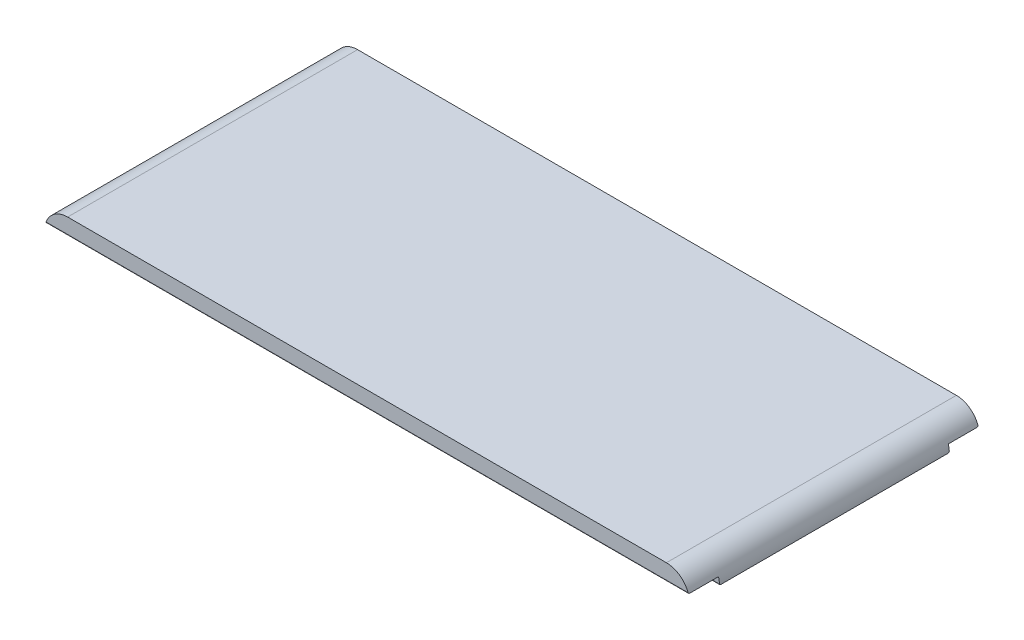
ISO-10303-21;
HEADER;
FILE_DESCRIPTION(('STEP AP214'),'2;1');
FILE_NAME('part.step','',(''),(''),'','','');
FILE_SCHEMA(('AUTOMOTIVE_DESIGN { 1 0 10303 214 1 1 1 1 }'));
ENDSEC;
DATA;
#1=APPLICATION_CONTEXT('core data for automotive mechanical design processes');
#2=APPLICATION_PROTOCOL_DEFINITION('international standard','automotive_design',2000,#1);
#3=PRODUCT_CONTEXT('',#1,'mechanical');
#4=PRODUCT('Part','Part','',(#3));
#5=PRODUCT_RELATED_PRODUCT_CATEGORY('part','',(#4));
#6=PRODUCT_DEFINITION_FORMATION('','',#4);
#7=PRODUCT_DEFINITION_CONTEXT('part definition',#1,'design');
#8=PRODUCT_DEFINITION('design','',#6,#7);
#9=PRODUCT_DEFINITION_SHAPE('','',#8);
#10=(LENGTH_UNIT() NAMED_UNIT(*) SI_UNIT(.MILLI.,.METRE.));
#11=(NAMED_UNIT(*) PLANE_ANGLE_UNIT() SI_UNIT($,.RADIAN.));
#12=(NAMED_UNIT(*) SI_UNIT($,.STERADIAN.) SOLID_ANGLE_UNIT());
#13=UNCERTAINTY_MEASURE_WITH_UNIT(LENGTH_MEASURE(1.E-05),#10,'distance_accuracy_value','');
#14=(GEOMETRIC_REPRESENTATION_CONTEXT(3) GLOBAL_UNCERTAINTY_ASSIGNED_CONTEXT((#13)) GLOBAL_UNIT_ASSIGNED_CONTEXT((#10,
#11,#12)) REPRESENTATION_CONTEXT('',''));
#15=CARTESIAN_POINT('',(0.,0.,0.));
#16=DIRECTION('',(0.,0.,1.));
#17=DIRECTION('',(1.,0.,0.));
#18=AXIS2_PLACEMENT_3D('',#15,#16,#17);
#19=CARTESIAN_POINT('',(-335.779914326901,-4.,0.));
#20=DIRECTION('',(0.,0.,-1.));
#21=DIRECTION('',(-1.,0.,0.));
#22=AXIS2_PLACEMENT_3D('',#19,#20,#21);
#23=CYLINDRICAL_SURFACE('',#22,10.);
#24=DIRECTION('',(0.,0.,1.));
#25=VECTOR('',#24,1.);
#26=CARTESIAN_POINT('',(-325.779914326901,-4.,0.));
#27=LINE('',#26,#25);
#28=CARTESIAN_POINT('',(-325.779914326901,-4.,-284.703611354948));
#29=VERTEX_POINT('',#28);
#30=CARTESIAN_POINT('',(-325.779914326901,-4.,-185.903611354948));
#31=VERTEX_POINT('',#30);
#32=EDGE_CURVE('E130',#29,#31,#27,.T.);
#33=ORIENTED_EDGE('',*,*,#32,.F.);
#34=CARTESIAN_POINT('',(-325.792422149182,-3.5,-285.203611354948));
#35=CARTESIAN_POINT('',(-325.791011271708,-3.52809080111915,-285.203635471879));
#36=CARTESIAN_POINT('',(-325.789728233576,-3.55618160499886,-285.201245470063));
#37=CARTESIAN_POINT('',(-325.787424342929,-3.6115583196578,-285.191808528034));
#38=CARTESIAN_POINT('',(-325.786403278723,-3.63884486443976,-285.184765364391));
#39=CARTESIAN_POINT('',(-325.784627081456,-3.69186985671174,-285.166188120238));
#40=CARTESIAN_POINT('',(-325.783872085288,-3.71760750164784,-285.15465173433));
#41=CARTESIAN_POINT('',(-325.782604001737,-3.76678300908643,-285.127422867738));
#42=CARTESIAN_POINT('',(-325.78209088282,-3.79022117107167,-285.111730929257));
#43=CARTESIAN_POINT('',(-325.781266074048,-3.83411984508959,-285.076643683722));
#44=CARTESIAN_POINT('',(-325.78095426411,-3.85458212662166,-285.057250593418));
#45=CARTESIAN_POINT('',(-325.780480422496,-3.89196426237688,-285.01530548335));
#46=CARTESIAN_POINT('',(-325.780318391846,-3.90888409231035,-284.992753441928));
#47=CARTESIAN_POINT('',(-325.780091008154,-3.93870360092056,-284.94512461966));
#48=CARTESIAN_POINT('',(-325.78002567722,-3.95160235974047,-284.920047262858));
#49=CARTESIAN_POINT('',(-325.779945052491,-3.97301175114872,-284.868080613789));
#50=CARTESIAN_POINT('',(-325.779929764532,-3.98152187189826,-284.841191110586));
#51=CARTESIAN_POINT('',(-325.779913988936,-3.9939020188409,-284.786368236673));
#52=CARTESIAN_POINT('',(-325.779913499656,-3.99777255979681,-284.758434982122));
#53=CARTESIAN_POINT('',(-325.779915206238,-4.00079506304713,-284.702292063512));
#54=CARTESIAN_POINT('',(-325.779917404333,-3.99994309610881,-284.674082188782));
#55=CARTESIAN_POINT('',(-325.779914875881,-3.99668645152289,-284.646143373658));
#56=B_SPLINE_CURVE_WITH_KNOTS('',3,(#34,#35,#36,#37,#38,#39,#40,#41,#42,#43,#44,#45,#46,#47,#48,
#49,#50,#51,#52,#53,#54,#55),.UNSPECIFIED.,.F.,.F.,(4,2,2,2,2,2,2,2,2,2,4),(0.,
0.0842678073475772,0.168467305649976,0.252710062350624,0.336941832739368,0.4211233111659,
0.505305366784203,0.58950666571089,0.673717782660477,0.757919555495587,0.842191396609046),.UNSPECIFIED.);
#57=CARTESIAN_POINT('',(-325.792422149182,-3.5,-285.203611354948));
#58=VERTEX_POINT('',#57);
#59=EDGE_CURVE('E11',#58,#29,#56,.T.);
#60=ORIENTED_EDGE('',*,*,#59,.F.);
#61=CARTESIAN_POINT('',(-335.779914326901,-4.,-285.203611354948));
#62=DIRECTION('',(0.,0.,-1.));
#63=DIRECTION('',(-1.,0.,0.));
#64=AXIS2_PLACEMENT_3D('',#61,#62,#63);
#65=CIRCLE('',#64,10.);
#66=CARTESIAN_POINT('',(-326.240522312731,-1.,-285.203611354948));
#67=VERTEX_POINT('',#66);
#68=EDGE_CURVE('E54',#67,#58,#65,.T.);
#69=ORIENTED_EDGE('',*,*,#68,.F.);
#70=DIRECTION('',(0.,0.,-1.));
#71=VECTOR('',#70,1.);
#72=CARTESIAN_POINT('',(-326.240522312731,-1.,0.));
#73=LINE('',#72,#71);
#74=CARTESIAN_POINT('',(-326.240522312731,-1.,-297.753611354948));
#75=VERTEX_POINT('',#74);
#76=EDGE_CURVE('E252',#75,#67,#73,.F.);
#77=ORIENTED_EDGE('',*,*,#76,.F.);
#78=CARTESIAN_POINT('',(-326.412417329303,-0.5,-298.253611354948));
#79=CARTESIAN_POINT('',(-326.401511394738,-0.529172653221636,-298.253630593243));
#80=CARTESIAN_POINT('',(-326.390747980806,-0.558411714080814,-298.251058502554));
#81=CARTESIAN_POINT('',(-326.369761504841,-0.616223919635847,-298.240797328865));
#82=CARTESIAN_POINT('',(-326.359539239715,-0.644796049399874,-298.233100914189));
#83=CARTESIAN_POINT('',(-326.33990830364,-0.700429394208502,-298.212641586647));
#84=CARTESIAN_POINT('',(-326.330500891963,-0.727488248556696,-298.199870996504));
#85=CARTESIAN_POINT('',(-326.312773136196,-0.779133501081687,-298.169520145201));
#86=CARTESIAN_POINT('',(-326.30445189417,-0.803721937630512,-298.151943894566));
#87=CARTESIAN_POINT('',(-326.289417162937,-0.848650370660997,-298.113178396005));
#88=CARTESIAN_POINT('',(-326.282653292116,-0.869119473225691,-298.092158542015));
#89=CARTESIAN_POINT('',(-326.270504515063,-0.906214806618339,-298.046615238539));
#90=CARTESIAN_POINT('',(-326.265119271472,-0.922841977497598,-298.022092648491));
#91=CARTESIAN_POINT('',(-326.256120178062,-0.950811508377243,-297.971681326914));
#92=CARTESIAN_POINT('',(-326.252426186524,-0.962391319981318,-297.945938516495));
#93=CARTESIAN_POINT('',(-326.24648610315,-0.981085965580566,-297.892721384494));
#94=CARTESIAN_POINT('',(-326.244239686956,-0.988201799812208,-297.86524745232));
#95=CARTESIAN_POINT('',(-326.241310304234,-0.997490833230506,-297.810532263963));
#96=CARTESIAN_POINT('',(-326.240568427805,-0.999850245592909,-297.783325611016));
#97=CARTESIAN_POINT('',(-326.240480049208,-1.00013751187326,-297.728847774794));
#98=CARTESIAN_POINT('',(-326.241135607125,-0.998058823173914,-297.701576555532));
#99=CARTESIAN_POINT('',(-326.242495743797,-0.993732086013512,-297.674689702401));
#100=B_SPLINE_CURVE_WITH_KNOTS('',3,(#78,#79,#80,#81,#82,#83,#84,#85,#86,#87,#88,#89,#90,#91,
#92,#93,#94,#95,#96,#97,#98,#99),.UNSPECIFIED.,.F.,.F.,(4,2,2,2,2,2,2,2,2,2,4),(0.,
0.0933472675150289,0.186828380337061,0.280451472874327,0.373996670254914,0.463860732501441,
0.553702783295467,0.638679019050742,0.723636207505771,0.805197184813385,0.886878481750885),.UNSPECIFIED.);
#101=CARTESIAN_POINT('',(-326.412417329303,-0.5,-298.253611354948));
#102=VERTEX_POINT('',#101);
#103=EDGE_CURVE('E245',#102,#75,#100,.T.);
#104=ORIENTED_EDGE('',*,*,#103,.F.);
#105=CARTESIAN_POINT('',(-335.779914326901,-4.,-298.253611354948));
#106=DIRECTION('',(0.,0.,-1.));
#107=DIRECTION('',(-1.,0.,0.));
#108=AXIS2_PLACEMENT_3D('',#105,#106,#107);
#109=CIRCLE('',#108,10.);
#110=CARTESIAN_POINT('',(-335.779914326901,6.,-298.253611354948));
#111=VERTEX_POINT('',#110);
#112=EDGE_CURVE('E242',#111,#102,#109,.T.);
#113=ORIENTED_EDGE('',*,*,#112,.F.);
#114=DIRECTION('',(0.,0.,1.));
#115=VECTOR('',#114,1.);
#116=CARTESIAN_POINT('',(-335.779914326901,6.,0.));
#117=LINE('',#116,#115);
#118=CARTESIAN_POINT('',(-335.779914326901,6.,-172.353611354948));
#119=VERTEX_POINT('',#118);
#120=EDGE_CURVE('E239',#119,#111,#117,.F.);
#121=ORIENTED_EDGE('',*,*,#120,.F.);
#122=CARTESIAN_POINT('',(-335.779914326901,-4.,-172.353611354948));
#123=DIRECTION('',(0.,0.,1.));
#124=DIRECTION('',(1.,0.,0.));
#125=AXIS2_PLACEMENT_3D('',#122,#123,#124);
#126=CIRCLE('',#125,10.);
#127=CARTESIAN_POINT('',(-326.412417329303,-0.5,-172.353611354948));
#128=VERTEX_POINT('',#127);
#129=EDGE_CURVE('E234',#128,#119,#126,.T.);
#130=ORIENTED_EDGE('',*,*,#129,.F.);
#131=CARTESIAN_POINT('',(-326.240522312731,-1.,-172.853611354948));
#132=CARTESIAN_POINT('',(-326.240516834523,-1.00002795140279,-172.826464107377));
#133=CARTESIAN_POINT('',(-326.241217073254,-0.997790921745027,-172.799330362119));
#134=CARTESIAN_POINT('',(-326.243986515588,-0.989000403490608,-172.745895702141));
#135=CARTESIAN_POINT('',(-326.24605303972,-0.982455363596605,-172.719593262696));
#136=CARTESIAN_POINT('',(-326.251513135226,-0.965260011054922,-172.668512589204));
#137=CARTESIAN_POINT('',(-326.254906831537,-0.95460931191396,-172.643734498909));
#138=CARTESIAN_POINT('',(-326.262945353714,-0.929580668969439,-172.596360736281));
#139=CARTESIAN_POINT('',(-326.267590389749,-0.915202099065748,-172.573765431425));
#140=CARTESIAN_POINT('',(-326.278122469576,-0.882911043350927,-172.530949494677));
#141=CARTESIAN_POINT('',(-326.284029670137,-0.864941554975013,-172.510776883163));
#142=CARTESIAN_POINT('',(-326.296905832196,-0.826206350932752,-172.473732486453));
#143=CARTESIAN_POINT('',(-326.303874886772,-0.805440390154803,-172.45686099092));
#144=CARTESIAN_POINT('',(-326.319052016118,-0.760761900585836,-172.426094589591));
#145=CARTESIAN_POINT('',(-326.32730095154,-0.736751472160278,-172.412362151231));
#146=CARTESIAN_POINT('',(-326.34461091894,-0.68703384227384,-172.389097891837));
#147=CARTESIAN_POINT('',(-326.353672519193,-0.661325456840943,-172.379569038253));
#148=CARTESIAN_POINT('',(-326.372903310711,-0.60750900852016,-172.364466238171));
#149=CARTESIAN_POINT('',(-326.383105804918,-0.579346105138669,-172.359130559073));
#150=CARTESIAN_POINT('',(-326.403919211593,-0.522694518658771,-172.353311920966));
#151=CARTESIAN_POINT('',(-326.414529816969,-0.494206091431464,-172.352825382144));
#152=CARTESIAN_POINT('',(-326.425219372644,-0.465925536608026,-172.354773775224));
#153=B_SPLINE_CURVE_WITH_KNOTS('',3,(#131,#132,#133,#134,#135,#136,#137,#138,#139,#140,#141,
#142,#143,#144,#145,#146,#147,#148,#149,#150,#151,#152),.UNSPECIFIED.,.F.,.F.,(4,2,2,2,2,2,2,2,
2,2,4),(0.,0.0813201609982403,0.162481313341148,0.243650107794974,0.324832543481057,
0.407423959785907,0.490022619969363,0.576234016887954,0.662506176293527,0.753383590636309,
0.844193910998825),.UNSPECIFIED.);
#154=CARTESIAN_POINT('',(-326.240522312731,-1.,-172.853611354948));
#155=VERTEX_POINT('',#154);
#156=EDGE_CURVE('E226',#155,#128,#153,.T.);
#157=ORIENTED_EDGE('',*,*,#156,.F.);
#158=DIRECTION('',(0.,0.,-1.));
#159=VECTOR('',#158,1.);
#160=CARTESIAN_POINT('',(-326.240522312731,-1.,0.));
#161=LINE('',#160,#159);
#162=CARTESIAN_POINT('',(-326.240522312731,-1.,-185.403611354948));
#163=VERTEX_POINT('',#162);
#164=EDGE_CURVE('E235',#163,#155,#161,.F.);
#165=ORIENTED_EDGE('',*,*,#164,.F.);
#166=CARTESIAN_POINT('',(-335.779914326901,-4.,-185.403611354948));
#167=DIRECTION('',(0.,0.,1.));
#168=DIRECTION('',(1.,0.,0.));
#169=AXIS2_PLACEMENT_3D('',#166,#167,#168);
#170=CIRCLE('',#169,10.);
#171=CARTESIAN_POINT('',(-325.792422149182,-3.5,-185.403611354948));
#172=VERTEX_POINT('',#171);
#173=EDGE_CURVE('E132',#172,#163,#170,.T.);
#174=ORIENTED_EDGE('',*,*,#173,.F.);
#175=CARTESIAN_POINT('',(-325.779914326901,-4.,-185.903611354948));
#176=CARTESIAN_POINT('',(-325.779917707812,-4.00002388656531,-185.875482249191));
#177=CARTESIAN_POINT('',(-325.779914383478,-3.9976276863461,-185.847360276428));
#178=CARTESIAN_POINT('',(-325.779919312572,-3.98817159620143,-185.791934515045));
#179=CARTESIAN_POINT('',(-325.779927556438,-3.98111556064199,-185.764630069707));
#180=CARTESIAN_POINT('',(-325.779980545843,-3.96251132893289,-185.711581620624));
#181=CARTESIAN_POINT('',(-325.780025308732,-3.9509609988357,-185.685838364872));
#182=CARTESIAN_POINT('',(-325.780196061062,-3.92370544649548,-185.636659052178));
#183=CARTESIAN_POINT('',(-325.780322041042,-3.90800070829474,-185.613222726884));
#184=CARTESIAN_POINT('',(-325.780706971633,-3.87288079822787,-185.569320807143));
#185=CARTESIAN_POINT('',(-325.780965916122,-3.85346579724859,-185.548855075953));
#186=CARTESIAN_POINT('',(-325.781669499671,-3.81147808534619,-185.511474312912));
#187=CARTESIAN_POINT('',(-325.782114136726,-3.7889054085522,-185.494559242689));
#188=CARTESIAN_POINT('',(-325.783233955363,-3.74125731239429,-185.464767548114));
#189=CARTESIAN_POINT('',(-325.783909021488,-3.71618315085061,-185.451888907484));
#190=CARTESIAN_POINT('',(-325.785519019617,-3.66423364484929,-185.430518652406));
#191=CARTESIAN_POINT('',(-325.786453986411,-3.63735805962226,-185.42202762571));
#192=CARTESIAN_POINT('',(-325.788592543248,-3.58258844321756,-185.409683147878));
#193=CARTESIAN_POINT('',(-325.789795991766,-3.55469495506332,-185.405827260234));
#194=CARTESIAN_POINT('',(-325.79244930988,-3.49864594646549,-185.402819083579));
#195=CARTESIAN_POINT('',(-325.793899372546,-3.4704902371846,-185.403670496405));
#196=CARTESIAN_POINT('',(-325.795460527222,-3.44261115719796,-185.406915753274));
#197=B_SPLINE_CURVE_WITH_KNOTS('',3,(#175,#176,#177,#178,#179,#180,#181,#182,#183,#184,#185,
#186,#187,#188,#189,#190,#191,#192,#193,#194,#195,#196),.UNSPECIFIED.,.F.,.F.,(4,2,2,2,2,2,2,2,
2,2,4),(0.,0.0842752187023845,0.168480816623155,0.252726445304886,0.336962262601395,
0.421194201109253,0.505425229282856,0.589614115065589,0.673814275643185,0.757970156184569,
0.84219222661053),.UNSPECIFIED.);
#198=EDGE_CURVE('E128',#31,#172,#197,.T.);
#199=ORIENTED_EDGE('',*,*,#198,.F.);
#200=EDGE_LOOP('',(#33,#60,#69,#77,#104,#113,#121,#130,#157,#165,#174,#199));
#201=FACE_BOUND('',#200,.T.);
#202=ADVANCED_FACE('F41',(#201),#23,.T.);
#203=CARTESIAN_POINT('',(-595.779914326901,-4.,0.));
#204=DIRECTION('',(0.,0.,-1.));
#205=DIRECTION('',(-1.,0.,0.));
#206=AXIS2_PLACEMENT_3D('',#203,#204,#205);
#207=CYLINDRICAL_SURFACE('',#206,10.);
#208=DIRECTION('',(0.,0.,1.));
#209=VECTOR('',#208,1.);
#210=CARTESIAN_POINT('',(-605.779914326901,-4.,0.));
#211=LINE('',#210,#209);
#212=CARTESIAN_POINT('',(-605.779914326901,-4.,-284.703611354948));
#213=VERTEX_POINT('',#212);
#214=CARTESIAN_POINT('',(-605.779914326901,-4.,-185.903611354948));
#215=VERTEX_POINT('',#214);
#216=EDGE_CURVE('E148',#213,#215,#211,.T.);
#217=ORIENTED_EDGE('',*,*,#216,.T.);
#218=CARTESIAN_POINT('',(-605.76740650462,-3.5,-185.403611354948));
#219=CARTESIAN_POINT('',(-605.768817382094,-3.52809080111914,-185.403587238017));
#220=CARTESIAN_POINT('',(-605.770100420226,-3.55618160499886,-185.405977239833));
#221=CARTESIAN_POINT('',(-605.772404310873,-3.61155831965781,-185.415414181862));
#222=CARTESIAN_POINT('',(-605.773425375078,-3.63884486443976,-185.422457345505));
#223=CARTESIAN_POINT('',(-605.775201572346,-3.69186985671173,-185.441034589658));
#224=CARTESIAN_POINT('',(-605.775956568514,-3.71760750164781,-185.452570975566));
#225=CARTESIAN_POINT('',(-605.777224652065,-3.76678300908641,-185.479799842158));
#226=CARTESIAN_POINT('',(-605.777737770982,-3.79022117107165,-185.495491780638));
#227=CARTESIAN_POINT('',(-605.778562579754,-3.83411984508959,-185.530579026174));
#228=CARTESIAN_POINT('',(-605.778874389692,-3.85458212662167,-185.549972116478));
#229=CARTESIAN_POINT('',(-605.779348231306,-3.89196426237689,-185.591917226546));
#230=CARTESIAN_POINT('',(-605.779510261956,-3.90888409231036,-185.614469267968));
#231=CARTESIAN_POINT('',(-605.779737645648,-3.93870360092056,-185.662098090236));
#232=CARTESIAN_POINT('',(-605.779802976582,-3.95160235974049,-185.687175447038));
#233=CARTESIAN_POINT('',(-605.779883601311,-3.97301175114873,-185.739142096107));
#234=CARTESIAN_POINT('',(-605.77989888927,-3.98152187189826,-185.76603159931));
#235=CARTESIAN_POINT('',(-605.779914664866,-3.99390201884089,-185.820854473223));
#236=CARTESIAN_POINT('',(-605.779915154145,-3.9977725597968,-185.848787727774));
#237=CARTESIAN_POINT('',(-605.779913447564,-4.00079506304714,-185.904930646384));
#238=CARTESIAN_POINT('',(-605.779911249469,-3.99994309610881,-185.933140521113));
#239=CARTESIAN_POINT('',(-605.779913777921,-3.99668645152289,-185.961079336238));
#240=B_SPLINE_CURVE_WITH_KNOTS('',3,(#218,#219,#220,#221,#222,#223,#224,#225,#226,#227,#228,
#229,#230,#231,#232,#233,#234,#235,#236,#237,#238,#239),.UNSPECIFIED.,.F.,.F.,(4,2,2,2,2,2,2,2,
2,2,4),(0.,0.0842678073475747,0.168467305649968,0.25271006235059,0.336941832739348,
0.421123311165919,0.50530536678424,0.589506665710928,0.673717782660512,0.757919555495511,
0.842191396608998),.UNSPECIFIED.);
#241=CARTESIAN_POINT('',(-605.76740650462,-3.5,-185.403611354948));
#242=VERTEX_POINT('',#241);
#243=EDGE_CURVE('E137',#242,#215,#240,.T.);
#244=ORIENTED_EDGE('',*,*,#243,.F.);
#245=CARTESIAN_POINT('',(-595.779914326901,-4.,-185.403611354948));
#246=DIRECTION('',(0.,0.,1.));
#247=DIRECTION('',(1.,0.,0.));
#248=AXIS2_PLACEMENT_3D('',#245,#246,#247);
#249=CIRCLE('',#248,10.);
#250=CARTESIAN_POINT('',(-605.31930634107,-1.,-185.403611354948));
#251=VERTEX_POINT('',#250);
#252=EDGE_CURVE('E302',#251,#242,#249,.T.);
#253=ORIENTED_EDGE('',*,*,#252,.F.);
#254=DIRECTION('',(0.,0.,-1.));
#255=VECTOR('',#254,1.);
#256=CARTESIAN_POINT('',(-605.31930634107,-1.,0.));
#257=LINE('',#256,#255);
#258=CARTESIAN_POINT('',(-605.31930634107,-1.,-172.853611354948));
#259=VERTEX_POINT('',#258);
#260=EDGE_CURVE('E213',#259,#251,#257,.T.);
#261=ORIENTED_EDGE('',*,*,#260,.F.);
#262=CARTESIAN_POINT('',(-605.147411324499,-0.500000000000016,-172.353611354948));
#263=CARTESIAN_POINT('',(-605.158317259064,-0.529172653221676,-172.353592116653));
#264=CARTESIAN_POINT('',(-605.169080672996,-0.558411714080868,-172.356164207342));
#265=CARTESIAN_POINT('',(-605.190067148961,-0.616223919635903,-172.366425381031));
#266=CARTESIAN_POINT('',(-605.200289414087,-0.644796049399918,-172.374121795707));
#267=CARTESIAN_POINT('',(-605.219920350162,-0.70042939420853,-172.394581123249));
#268=CARTESIAN_POINT('',(-605.229327761839,-0.727488248556719,-172.407351713392));
#269=CARTESIAN_POINT('',(-605.247055517606,-0.779133501081707,-172.437702564695));
#270=CARTESIAN_POINT('',(-605.255376759632,-0.803721937630533,-172.45527881533));
#271=CARTESIAN_POINT('',(-605.270411490864,-0.848650370661007,-172.494044313891));
#272=CARTESIAN_POINT('',(-605.277175361686,-0.86911947322569,-172.515064167881));
#273=CARTESIAN_POINT('',(-605.289324138739,-0.906214806618347,-172.560607471357));
#274=CARTESIAN_POINT('',(-605.294709382329,-0.922841977497623,-172.585130061405));
#275=CARTESIAN_POINT('',(-605.303708475739,-0.950811508377274,-172.635541382982));
#276=CARTESIAN_POINT('',(-605.307402467278,-0.96239131998134,-172.661284193401));
#277=CARTESIAN_POINT('',(-605.313342550652,-0.981085965580579,-172.714501325402));
#278=CARTESIAN_POINT('',(-605.315588966845,-0.988201799812222,-172.741975257576));
#279=CARTESIAN_POINT('',(-605.318518349568,-0.997490833230516,-172.796690445933));
#280=CARTESIAN_POINT('',(-605.319260225997,-0.999850245592914,-172.82389709888));
#281=CARTESIAN_POINT('',(-605.319348604594,-1.00013751187325,-172.878374935102));
#282=CARTESIAN_POINT('',(-605.318693046677,-0.998058823173903,-172.905646154364));
#283=CARTESIAN_POINT('',(-605.317332910005,-0.993732086013495,-172.932533007495));
#284=B_SPLINE_CURVE_WITH_KNOTS('',3,(#262,#263,#264,#265,#266,#267,#268,#269,#270,#271,#272,
#273,#274,#275,#276,#277,#278,#279,#280,#281,#282,#283),.UNSPECIFIED.,.F.,.F.,(4,2,2,2,2,2,2,2,
2,2,4),(0.,0.0933472675150529,0.18682838033706,0.280451472874314,0.373996670254899,
0.463860732501399,0.553702783295465,0.638679019050776,0.723636207505803,0.805197184813415,
0.886878481750972),.UNSPECIFIED.);
#285=CARTESIAN_POINT('',(-605.147411324499,-0.5,-172.353611354948));
#286=VERTEX_POINT('',#285);
#287=EDGE_CURVE('E205',#286,#259,#284,.T.);
#288=ORIENTED_EDGE('',*,*,#287,.F.);
#289=CARTESIAN_POINT('',(-595.779914326901,-4.,-172.353611354948));
#290=DIRECTION('',(0.,0.,1.));
#291=DIRECTION('',(1.,0.,0.));
#292=AXIS2_PLACEMENT_3D('',#289,#290,#291);
#293=CIRCLE('',#292,10.);
#294=CARTESIAN_POINT('',(-595.779914326901,6.,-172.353611354948));
#295=VERTEX_POINT('',#294);
#296=EDGE_CURVE('E214',#295,#286,#293,.T.);
#297=ORIENTED_EDGE('',*,*,#296,.F.);
#298=DIRECTION('',(0.,0.,-1.));
#299=VECTOR('',#298,1.);
#300=CARTESIAN_POINT('',(-595.779914326901,6.,0.));
#301=LINE('',#300,#299);
#302=CARTESIAN_POINT('',(-595.779914326901,6.,-298.253611354948));
#303=VERTEX_POINT('',#302);
#304=EDGE_CURVE('E271',#303,#295,#301,.F.);
#305=ORIENTED_EDGE('',*,*,#304,.F.);
#306=CARTESIAN_POINT('',(-595.779914326901,-4.,-298.253611354948));
#307=DIRECTION('',(0.,0.,-1.));
#308=DIRECTION('',(-1.,0.,0.));
#309=AXIS2_PLACEMENT_3D('',#306,#307,#308);
#310=CIRCLE('',#309,10.);
#311=CARTESIAN_POINT('',(-605.147411324499,-0.5,-298.253611354948));
#312=VERTEX_POINT('',#311);
#313=EDGE_CURVE('E267',#312,#303,#310,.T.);
#314=ORIENTED_EDGE('',*,*,#313,.F.);
#315=CARTESIAN_POINT('',(-605.31930634107,-1.,-297.753611354948));
#316=CARTESIAN_POINT('',(-605.319311819279,-1.00002795140278,-297.780758602519));
#317=CARTESIAN_POINT('',(-605.318611580548,-0.997790921745017,-297.807892347777));
#318=CARTESIAN_POINT('',(-605.315842138214,-0.989000403490586,-297.861327007755));
#319=CARTESIAN_POINT('',(-605.313775614082,-0.982455363596581,-297.8876294472));
#320=CARTESIAN_POINT('',(-605.308315518575,-0.965260011054894,-297.938710120692));
#321=CARTESIAN_POINT('',(-605.304921822265,-0.954609311913933,-297.963488210987));
#322=CARTESIAN_POINT('',(-605.296883300088,-0.929580668969398,-298.010861973615));
#323=CARTESIAN_POINT('',(-605.292238264053,-0.915202099065687,-298.033457278471));
#324=CARTESIAN_POINT('',(-605.281706184226,-0.88291104335085,-298.076273215219));
#325=CARTESIAN_POINT('',(-605.275798983665,-0.86494155497494,-298.096445826733));
#326=CARTESIAN_POINT('',(-605.262922821606,-0.826206350932676,-298.133490223443));
#327=CARTESIAN_POINT('',(-605.255953767029,-0.805440390154727,-298.150361718976));
#328=CARTESIAN_POINT('',(-605.240776637684,-0.760761900585745,-298.181128120305));
#329=CARTESIAN_POINT('',(-605.232527702262,-0.736751472160171,-298.194860558665));
#330=CARTESIAN_POINT('',(-605.215217734861,-0.687033842273726,-298.218124818059));
#331=CARTESIAN_POINT('',(-605.206156134609,-0.661325456840837,-298.227653671643));
#332=CARTESIAN_POINT('',(-605.186925343091,-0.607509008520056,-298.242756471725));
#333=CARTESIAN_POINT('',(-605.176722848884,-0.579346105138555,-298.248092150823));
#334=CARTESIAN_POINT('',(-605.155909442209,-0.522694518658651,-298.25391078893));
#335=CARTESIAN_POINT('',(-605.145298836833,-0.494206091431348,-298.254397327752));
#336=CARTESIAN_POINT('',(-605.134609281158,-0.465925536607932,-298.252448934672));
#337=B_SPLINE_CURVE_WITH_KNOTS('',3,(#315,#316,#317,#318,#319,#320,#321,#322,#323,#324,#325,
#326,#327,#328,#329,#330,#331,#332,#333,#334,#335,#336),.UNSPECIFIED.,.F.,.F.,(4,2,2,2,2,2,2,2,
2,2,4),(0.,0.0813201609982942,0.162481313341182,0.24365010779495,0.324832543481076,
0.407423959786006,0.49002261996942,0.576234016888005,0.662506176293608,0.75338359063639,
0.844193910998881),.UNSPECIFIED.);
#338=CARTESIAN_POINT('',(-605.31930634107,-1.,-297.753611354948));
#339=VERTEX_POINT('',#338);
#340=EDGE_CURVE('E198',#339,#312,#337,.T.);
#341=ORIENTED_EDGE('',*,*,#340,.F.);
#342=DIRECTION('',(0.,0.,-1.));
#343=VECTOR('',#342,1.);
#344=CARTESIAN_POINT('',(-605.31930634107,-1.,0.));
#345=LINE('',#344,#343);
#346=CARTESIAN_POINT('',(-605.31930634107,-1.,-285.203611354948));
#347=VERTEX_POINT('',#346);
#348=EDGE_CURVE('E263',#347,#339,#345,.T.);
#349=ORIENTED_EDGE('',*,*,#348,.F.);
#350=CARTESIAN_POINT('',(-595.779914326901,-4.,-285.203611354948));
#351=DIRECTION('',(0.,0.,-1.));
#352=DIRECTION('',(-1.,0.,0.));
#353=AXIS2_PLACEMENT_3D('',#350,#351,#352);
#354=CIRCLE('',#353,10.);
#355=CARTESIAN_POINT('',(-605.76740650462,-3.5,-285.203611354948));
#356=VERTEX_POINT('',#355);
#357=EDGE_CURVE('E181',#356,#347,#354,.T.);
#358=ORIENTED_EDGE('',*,*,#357,.F.);
#359=CARTESIAN_POINT('',(-605.779914326901,-4.,-284.703611354948));
#360=CARTESIAN_POINT('',(-605.77991094599,-4.00002388656531,-284.731740460705));
#361=CARTESIAN_POINT('',(-605.779914270324,-3.99762768634608,-284.759862433469));
#362=CARTESIAN_POINT('',(-605.77990934123,-3.98817159620139,-284.815288194851));
#363=CARTESIAN_POINT('',(-605.779901097364,-3.98111556064196,-284.842592640189));
#364=CARTESIAN_POINT('',(-605.779848107959,-3.96251132893285,-284.895641089273));
#365=CARTESIAN_POINT('',(-605.77980334507,-3.95096099883564,-284.921384345024));
#366=CARTESIAN_POINT('',(-605.77963259274,-3.92370544649542,-284.970563657718));
#367=CARTESIAN_POINT('',(-605.77950661276,-3.90800070829469,-284.993999983012));
#368=CARTESIAN_POINT('',(-605.779121682169,-3.87288079822782,-285.037901902753));
#369=CARTESIAN_POINT('',(-605.77886273768,-3.85346579724852,-285.058367633943));
#370=CARTESIAN_POINT('',(-605.77815915413,-3.81147808534611,-285.095748396984));
#371=CARTESIAN_POINT('',(-605.777714517076,-3.78890540855211,-285.112663467207));
#372=CARTESIAN_POINT('',(-605.776594698439,-3.74125731239419,-285.142455161782));
#373=CARTESIAN_POINT('',(-605.775919632314,-3.7161831508505,-285.155333802412));
#374=CARTESIAN_POINT('',(-605.774309634184,-3.66423364484919,-285.17670405749));
#375=CARTESIAN_POINT('',(-605.77337466739,-3.63735805962217,-285.185195084186));
#376=CARTESIAN_POINT('',(-605.771236110554,-3.58258844321746,-285.197539562018));
#377=CARTESIAN_POINT('',(-605.770032662036,-3.55469495506322,-285.201395449662));
#378=CARTESIAN_POINT('',(-605.767379343922,-3.4986459464654,-285.204403626317));
#379=CARTESIAN_POINT('',(-605.765929281256,-3.4704902371845,-285.203552213491));
#380=CARTESIAN_POINT('',(-605.76436812658,-3.44261115719786,-285.200306956622));
#381=B_SPLINE_CURVE_WITH_KNOTS('',3,(#359,#360,#361,#362,#363,#364,#365,#366,#367,#368,#369,
#370,#371,#372,#373,#374,#375,#376,#377,#378,#379,#380),.UNSPECIFIED.,.F.,.F.,(4,2,2,2,2,2,2,2,
2,2,4),(0.,0.0842752187024975,0.168480816623188,0.252726445304985,0.336962262601438,
0.421194201109291,0.50542522928292,0.589614115065637,0.67381427564322,0.757970156184614,
0.842192226610576),.UNSPECIFIED.);
#382=EDGE_CURVE('E174',#213,#356,#381,.T.);
#383=ORIENTED_EDGE('',*,*,#382,.F.);
#384=EDGE_LOOP('',(#217,#244,#253,#261,#288,#297,#305,#314,#341,#349,#358,#383));
#385=FACE_BOUND('',#384,.T.);
#386=ADVANCED_FACE('F187',(#385),#207,.T.);
#387=CARTESIAN_POINT('',(-310.971048739017,-0.5,-297.753611354948));
#388=DIRECTION('',(1.,0.,0.));
#389=DIRECTION('',(0.,0.,-1.));
#390=AXIS2_PLACEMENT_3D('',#387,#388,#389);
#391=CYLINDRICAL_SURFACE('',#390,0.5);
#392=DIRECTION('',(1.,0.,0.));
#393=VECTOR('',#392,1.);
#394=CARTESIAN_POINT('',(-310.971048739017,-0.5,-298.253611354948));
#395=LINE('',#394,#393);
#396=EDGE_CURVE('E172',#102,#312,#395,.F.);
#397=ORIENTED_EDGE('',*,*,#396,.F.);
#398=ORIENTED_EDGE('',*,*,#103,.T.);
#399=DIRECTION('',(1.,0.,0.));
#400=VECTOR('',#399,1.);
#401=CARTESIAN_POINT('',(-310.971048739017,-1.,-297.753611354948));
#402=LINE('',#401,#400);
#403=EDGE_CURVE('E169',#339,#75,#402,.T.);
#404=ORIENTED_EDGE('',*,*,#403,.F.);
#405=ORIENTED_EDGE('',*,*,#340,.T.);
#406=EDGE_LOOP('',(#397,#398,#404,#405));
#407=FACE_BOUND('',#406,.T.);
#408=ADVANCED_FACE('F190',(#407),#391,.T.);
#409=CARTESIAN_POINT('',(0.,-3.5,-284.703611354948));
#410=DIRECTION('',(-1.,0.,0.));
#411=DIRECTION('',(0.,0.,1.));
#412=AXIS2_PLACEMENT_3D('',#409,#410,#411);
#413=CYLINDRICAL_SURFACE('',#412,0.5);
#414=DIRECTION('',(1.,0.,0.));
#415=VECTOR('',#414,1.);
#416=CARTESIAN_POINT('',(0.,-3.5,-285.203611354948));
#417=LINE('',#416,#415);
#418=EDGE_CURVE('E167',#58,#356,#417,.F.);
#419=ORIENTED_EDGE('',*,*,#418,.F.);
#420=ORIENTED_EDGE('',*,*,#59,.T.);
#421=DIRECTION('',(1.,0.,0.));
#422=VECTOR('',#421,1.);
#423=CARTESIAN_POINT('',(0.,-4.,-284.703611354948));
#424=LINE('',#423,#422);
#425=EDGE_CURVE('E146',#213,#29,#424,.T.);
#426=ORIENTED_EDGE('',*,*,#425,.F.);
#427=ORIENTED_EDGE('',*,*,#382,.T.);
#428=EDGE_LOOP('',(#419,#420,#426,#427));
#429=FACE_BOUND('',#428,.T.);
#430=ADVANCED_FACE('F183',(#429),#413,.T.);
#431=CARTESIAN_POINT('',(-310.971048739017,-0.5,-172.853611354948));
#432=DIRECTION('',(-1.,0.,0.));
#433=DIRECTION('',(0.,0.,1.));
#434=AXIS2_PLACEMENT_3D('',#431,#432,#433);
#435=CYLINDRICAL_SURFACE('',#434,0.5);
#436=DIRECTION('',(-1.,0.,0.));
#437=VECTOR('',#436,1.);
#438=CARTESIAN_POINT('',(-310.971048739017,-1.,-172.853611354948));
#439=LINE('',#438,#437);
#440=EDGE_CURVE('E154',#155,#259,#439,.T.);
#441=ORIENTED_EDGE('',*,*,#440,.F.);
#442=ORIENTED_EDGE('',*,*,#156,.T.);
#443=DIRECTION('',(-1.,0.,0.));
#444=VECTOR('',#443,1.);
#445=CARTESIAN_POINT('',(-310.971048739017,-0.5,-172.353611354948));
#446=LINE('',#445,#444);
#447=EDGE_CURVE('E163',#286,#128,#446,.F.);
#448=ORIENTED_EDGE('',*,*,#447,.F.);
#449=ORIENTED_EDGE('',*,*,#287,.T.);
#450=EDGE_LOOP('',(#441,#442,#448,#449));
#451=FACE_BOUND('',#450,.T.);
#452=ADVANCED_FACE('F217',(#451),#435,.T.);
#453=CARTESIAN_POINT('',(0.,-3.5,-185.903611354948));
#454=DIRECTION('',(1.,0.,0.));
#455=DIRECTION('',(0.,0.,-1.));
#456=AXIS2_PLACEMENT_3D('',#453,#454,#455);
#457=CYLINDRICAL_SURFACE('',#456,0.5);
#458=DIRECTION('',(-1.,0.,0.));
#459=VECTOR('',#458,1.);
#460=CARTESIAN_POINT('',(0.,-4.,-185.903611354948));
#461=LINE('',#460,#459);
#462=EDGE_CURVE('E144',#31,#215,#461,.T.);
#463=ORIENTED_EDGE('',*,*,#462,.F.);
#464=ORIENTED_EDGE('',*,*,#198,.T.);
#465=DIRECTION('',(-1.,0.,0.));
#466=VECTOR('',#465,1.);
#467=CARTESIAN_POINT('',(0.,-3.5,-185.403611354948));
#468=LINE('',#467,#466);
#469=EDGE_CURVE('E152',#242,#172,#468,.F.);
#470=ORIENTED_EDGE('',*,*,#469,.F.);
#471=ORIENTED_EDGE('',*,*,#243,.T.);
#472=EDGE_LOOP('',(#463,#464,#470,#471));
#473=FACE_BOUND('',#472,.T.);
#474=ADVANCED_FACE('F150',(#473),#457,.T.);
#475=CARTESIAN_POINT('',(0.,0.,-185.403611354948));
#476=DIRECTION('',(0.,0.,1.));
#477=DIRECTION('',(1.,0.,0.));
#478=AXIS2_PLACEMENT_3D('',#475,#476,#477);
#479=PLANE('',#478);
#480=ORIENTED_EDGE('',*,*,#469,.T.);
#481=ORIENTED_EDGE('',*,*,#173,.T.);
#482=DIRECTION('',(-1.,0.,0.));
#483=VECTOR('',#482,1.);
#484=CARTESIAN_POINT('',(-310.971048739017,-1.,-185.403611354948));
#485=LINE('',#484,#483);
#486=EDGE_CURVE('E292',#163,#251,#485,.T.);
#487=ORIENTED_EDGE('',*,*,#486,.T.);
#488=ORIENTED_EDGE('',*,*,#252,.T.);
#489=EDGE_LOOP('',(#480,#481,#487,#488));
#490=FACE_BOUND('',#489,.T.);
#491=ADVANCED_FACE('F305',(#490),#479,.T.);
#492=CARTESIAN_POINT('',(0.,-4.,0.));
#493=DIRECTION('',(0.,1.,0.));
#494=DIRECTION('',(0.,0.,1.));
#495=AXIS2_PLACEMENT_3D('',#492,#493,#494);
#496=PLANE('',#495);
#497=CARTESIAN_POINT('',(-493.034712476764,-4.,-239.437372330054));
#498=DIRECTION('',(0.,-1.,0.));
#499=DIRECTION('',(0.,0.,-1.));
#500=AXIS2_PLACEMENT_3D('',#497,#498,#499);
#501=CIRCLE('',#500,18.5499999999999);
#502=CARTESIAN_POINT('',(-493.034712476764,-4.,-257.987372330054));
#503=VERTEX_POINT('',#502);
#504=EDGE_CURVE('E308',#503,#503,#501,.T.);
#505=ORIENTED_EDGE('',*,*,#504,.F.);
#506=EDGE_LOOP('',(#505));
#507=FACE_BOUND('',#506,.T.);
#508=CARTESIAN_POINT('',(-402.392880512729,-4.,-240.117860910898));
#509=DIRECTION('',(0.,1.,0.));
#510=DIRECTION('',(0.,0.,1.));
#511=AXIS2_PLACEMENT_3D('',#508,#509,#510);
#512=CIRCLE('',#511,18.55);
#513=CARTESIAN_POINT('',(-402.392880512729,-4.,-221.567860910898));
#514=VERTEX_POINT('',#513);
#515=EDGE_CURVE('E318',#514,#514,#512,.T.);
#516=ORIENTED_EDGE('',*,*,#515,.T.);
#517=EDGE_LOOP('',(#516));
#518=FACE_BOUND('',#517,.T.);
#519=CARTESIAN_POINT('',(-581.279914326901,-4.,-209.803611354948));
#520=DIRECTION('',(0.,1.,0.));
#521=DIRECTION('',(0.,0.,1.));
#522=AXIS2_PLACEMENT_3D('',#519,#520,#521);
#523=CIRCLE('',#522,18.55);
#524=CARTESIAN_POINT('',(-581.279914326901,-4.,-191.253611354948));
#525=VERTEX_POINT('',#524);
#526=EDGE_CURVE('E147',#525,#525,#523,.T.);
#527=ORIENTED_EDGE('',*,*,#526,.T.);
#528=EDGE_LOOP('',(#527));
#529=FACE_BOUND('',#528,.T.);
#530=ORIENTED_EDGE('',*,*,#216,.F.);
#531=ORIENTED_EDGE('',*,*,#425,.T.);
#532=ORIENTED_EDGE('',*,*,#32,.T.);
#533=ORIENTED_EDGE('',*,*,#462,.T.);
#534=EDGE_LOOP('',(#530,#531,#532,#533));
#535=FACE_BOUND('',#534,.T.);
#536=ADVANCED_FACE('F143',(#507,#518,#529,#535),#496,.F.);
#537=CARTESIAN_POINT('',(0.,6.,0.));
#538=DIRECTION('',(0.,1.,0.));
#539=DIRECTION('',(0.,0.,1.));
#540=AXIS2_PLACEMENT_3D('',#537,#538,#539);
#541=PLANE('',#540);
#542=DIRECTION('',(-1.,0.,0.));
#543=VECTOR('',#542,1.);
#544=CARTESIAN_POINT('',(-310.971048739017,6.,-172.353611354948));
#545=LINE('',#544,#543);
#546=EDGE_CURVE('E284',#119,#295,#545,.T.);
#547=ORIENTED_EDGE('',*,*,#546,.F.);
#548=ORIENTED_EDGE('',*,*,#120,.T.);
#549=DIRECTION('',(-1.,0.,0.));
#550=VECTOR('',#549,1.);
#551=CARTESIAN_POINT('',(-310.971048739017,6.,-298.253611354948));
#552=LINE('',#551,#550);
#553=EDGE_CURVE('E306',#111,#303,#552,.T.);
#554=ORIENTED_EDGE('',*,*,#553,.T.);
#555=ORIENTED_EDGE('',*,*,#304,.T.);
#556=EDGE_LOOP('',(#547,#548,#554,#555));
#557=FACE_BOUND('',#556,.T.);
#558=ADVANCED_FACE('F388',(#557),#541,.T.);
#559=CARTESIAN_POINT('',(-402.392880512729,-4.,-240.117860910898));
#560=DIRECTION('',(0.,1.,0.));
#561=DIRECTION('',(0.,0.,1.));
#562=AXIS2_PLACEMENT_3D('',#559,#560,#561);
#563=CYLINDRICAL_SURFACE('',#562,18.55);
#564=ORIENTED_EDGE('',*,*,#515,.F.);
#565=EDGE_LOOP('',(#564));
#566=FACE_BOUND('',#565,.T.);
#567=CARTESIAN_POINT('',(-402.392880512729,0.,-240.117860910898));
#568=DIRECTION('',(0.,1.,0.));
#569=DIRECTION('',(0.,0.,1.));
#570=AXIS2_PLACEMENT_3D('',#567,#568,#569);
#571=CIRCLE('',#570,18.55);
#572=CARTESIAN_POINT('',(-402.392880512729,0.,-221.567860910898));
#573=VERTEX_POINT('',#572);
#574=EDGE_CURVE('E321',#573,#573,#571,.T.);
#575=ORIENTED_EDGE('',*,*,#574,.T.);
#576=EDGE_LOOP('',(#575));
#577=FACE_BOUND('',#576,.T.);
#578=ADVANCED_FACE('F340',(#566,#577),#563,.F.);
#579=CARTESIAN_POINT('',(-581.279914326901,-4.,-209.803611354948));
#580=DIRECTION('',(0.,1.,0.));
#581=DIRECTION('',(0.,0.,1.));
#582=AXIS2_PLACEMENT_3D('',#579,#580,#581);
#583=CYLINDRICAL_SURFACE('',#582,18.55);
#584=ORIENTED_EDGE('',*,*,#526,.F.);
#585=EDGE_LOOP('',(#584));
#586=FACE_BOUND('',#585,.T.);
#587=CARTESIAN_POINT('',(-581.279914326901,0.,-209.803611354948));
#588=DIRECTION('',(0.,1.,0.));
#589=DIRECTION('',(0.,0.,1.));
#590=AXIS2_PLACEMENT_3D('',#587,#588,#589);
#591=CIRCLE('',#590,18.55);
#592=CARTESIAN_POINT('',(-581.279914326901,0.,-191.253611354948));
#593=VERTEX_POINT('',#592);
#594=EDGE_CURVE('E159',#593,#593,#591,.T.);
#595=ORIENTED_EDGE('',*,*,#594,.T.);
#596=EDGE_LOOP('',(#595));
#597=FACE_BOUND('',#596,.T.);
#598=ADVANCED_FACE('F328',(#586,#597),#583,.F.);
#599=CARTESIAN_POINT('',(0.,0.,0.));
#600=DIRECTION('',(0.,1.,0.));
#601=DIRECTION('',(0.,0.,1.));
#602=AXIS2_PLACEMENT_3D('',#599,#600,#601);
#603=PLANE('',#602);
#604=ORIENTED_EDGE('',*,*,#594,.F.);
#605=EDGE_LOOP('',(#604));
#606=FACE_BOUND('',#605,.T.);
#607=ADVANCED_FACE('F330',(#606),#603,.F.);
#608=ORIENTED_EDGE('',*,*,#574,.F.);
#609=EDGE_LOOP('',(#608));
#610=FACE_BOUND('',#609,.T.);
#611=ADVANCED_FACE('F332',(#610),#603,.F.);
#612=CARTESIAN_POINT('',(0.,0.,-285.203611354948));
#613=DIRECTION('',(0.,0.,-1.));
#614=DIRECTION('',(-1.,0.,0.));
#615=AXIS2_PLACEMENT_3D('',#612,#613,#614);
#616=PLANE('',#615);
#617=DIRECTION('',(-1.,0.,0.));
#618=VECTOR('',#617,1.);
#619=CARTESIAN_POINT('',(-310.971048739017,-1.,-285.203611354948));
#620=LINE('',#619,#618);
#621=EDGE_CURVE('E259',#67,#347,#620,.T.);
#622=ORIENTED_EDGE('',*,*,#621,.F.);
#623=ORIENTED_EDGE('',*,*,#68,.T.);
#624=ORIENTED_EDGE('',*,*,#418,.T.);
#625=ORIENTED_EDGE('',*,*,#357,.T.);
#626=EDGE_LOOP('',(#622,#623,#624,#625));
#627=FACE_BOUND('',#626,.T.);
#628=ADVANCED_FACE('F256',(#627),#616,.T.);
#629=CARTESIAN_POINT('',(-493.034712476764,0.,-239.437372330054));
#630=DIRECTION('',(0.,-1.,0.));
#631=DIRECTION('',(0.,0.,-1.));
#632=AXIS2_PLACEMENT_3D('',#629,#630,#631);
#633=CYLINDRICAL_SURFACE('',#632,18.5499999999999);
#634=CARTESIAN_POINT('',(-493.034712476764,0.,-239.437372330054));
#635=DIRECTION('',(0.,-1.,0.));
#636=DIRECTION('',(0.,0.,-1.));
#637=AXIS2_PLACEMENT_3D('',#634,#635,#636);
#638=CIRCLE('',#637,18.5499999999999);
#639=CARTESIAN_POINT('',(-493.034712476764,0.,-257.987372330054));
#640=VERTEX_POINT('',#639);
#641=EDGE_CURVE('E313',#640,#640,#638,.T.);
#642=ORIENTED_EDGE('',*,*,#641,.F.);
#643=EDGE_LOOP('',(#642));
#644=FACE_BOUND('',#643,.T.);
#645=ORIENTED_EDGE('',*,*,#504,.T.);
#646=EDGE_LOOP('',(#645));
#647=FACE_BOUND('',#646,.T.);
#648=ADVANCED_FACE('F399',(#644,#647),#633,.F.);
#649=CARTESIAN_POINT('',(0.,0.,0.));
#650=DIRECTION('',(0.,-1.,0.));
#651=DIRECTION('',(0.,0.,-1.));
#652=AXIS2_PLACEMENT_3D('',#649,#650,#651);
#653=PLANE('',#652);
#654=ORIENTED_EDGE('',*,*,#641,.T.);
#655=EDGE_LOOP('',(#654));
#656=FACE_BOUND('',#655,.T.);
#657=ADVANCED_FACE('F407',(#656),#653,.T.);
#658=CARTESIAN_POINT('',(-310.971048739017,6.,-172.353611354948));
#659=DIRECTION('',(0.,0.,1.));
#660=DIRECTION('',(1.,0.,0.));
#661=AXIS2_PLACEMENT_3D('',#658,#659,#660);
#662=PLANE('',#661);
#663=ORIENTED_EDGE('',*,*,#447,.T.);
#664=ORIENTED_EDGE('',*,*,#129,.T.);
#665=ORIENTED_EDGE('',*,*,#546,.T.);
#666=ORIENTED_EDGE('',*,*,#296,.T.);
#667=EDGE_LOOP('',(#663,#664,#665,#666));
#668=FACE_BOUND('',#667,.T.);
#669=ADVANCED_FACE('F283',(#668),#662,.T.);
#670=CARTESIAN_POINT('',(-310.971048739017,-1.,-185.403611354948));
#671=DIRECTION('',(0.,-1.,0.));
#672=DIRECTION('',(0.,0.,-1.));
#673=AXIS2_PLACEMENT_3D('',#670,#671,#672);
#674=PLANE('',#673);
#675=CARTESIAN_POINT('',(-336.240522312731,-1.,-178.853611354948));
#676=DIRECTION('',(0.,-1.,0.));
#677=DIRECTION('',(0.,0.,-1.));
#678=AXIS2_PLACEMENT_3D('',#675,#676,#677);
#679=CIRCLE('',#678,5.17499999999997);
#680=CARTESIAN_POINT('',(-336.240522312731,-1.,-184.028611354948));
#681=VERTEX_POINT('',#680);
#682=EDGE_CURVE('E575',#681,#681,#679,.T.);
#683=ORIENTED_EDGE('',*,*,#682,.F.);
#684=EDGE_LOOP('',(#683));
#685=FACE_BOUND('',#684,.T.);
#686=CARTESIAN_POINT('',(-571.220522312732,-1.,-178.853611354948));
#687=DIRECTION('',(0.,-1.,0.));
#688=DIRECTION('',(0.,0.,-1.));
#689=AXIS2_PLACEMENT_3D('',#686,#687,#688);
#690=CIRCLE('',#689,5.17499999999996);
#691=CARTESIAN_POINT('',(-571.220522312732,-1.,-184.028611354948));
#692=VERTEX_POINT('',#691);
#693=EDGE_CURVE('E583',#692,#692,#690,.T.);
#694=ORIENTED_EDGE('',*,*,#693,.F.);
#695=EDGE_LOOP('',(#694));
#696=FACE_BOUND('',#695,.T.);
#697=ORIENTED_EDGE('',*,*,#486,.F.);
#698=ORIENTED_EDGE('',*,*,#164,.T.);
#699=ORIENTED_EDGE('',*,*,#440,.T.);
#700=ORIENTED_EDGE('',*,*,#260,.T.);
#701=EDGE_LOOP('',(#697,#698,#699,#700));
#702=FACE_BOUND('',#701,.T.);
#703=ADVANCED_FACE('F289',(#685,#696,#702),#674,.T.);
#704=CARTESIAN_POINT('',(-310.971048739017,-1.,-285.203611354948));
#705=DIRECTION('',(0.,-1.,0.));
#706=DIRECTION('',(0.,0.,-1.));
#707=AXIS2_PLACEMENT_3D('',#704,#705,#706);
#708=PLANE('',#707);
#709=CARTESIAN_POINT('',(-465.693966818615,-1.,-291.253611354948));
#710=DIRECTION('',(0.,-1.,0.));
#711=DIRECTION('',(0.,0.,-1.));
#712=AXIS2_PLACEMENT_3D('',#709,#710,#711);
#713=CIRCLE('',#712,5.17499999999997);
#714=CARTESIAN_POINT('',(-465.693966818615,-1.,-296.428611354948));
#715=VERTEX_POINT('',#714);
#716=EDGE_CURVE('E589',#715,#715,#713,.T.);
#717=ORIENTED_EDGE('',*,*,#716,.F.);
#718=EDGE_LOOP('',(#717));
#719=FACE_BOUND('',#718,.T.);
#720=ORIENTED_EDGE('',*,*,#403,.T.);
#721=ORIENTED_EDGE('',*,*,#76,.T.);
#722=ORIENTED_EDGE('',*,*,#621,.T.);
#723=ORIENTED_EDGE('',*,*,#348,.T.);
#724=EDGE_LOOP('',(#720,#721,#722,#723));
#725=FACE_BOUND('',#724,.T.);
#726=ADVANCED_FACE('F416',(#719,#725),#708,.T.);
#727=CARTESIAN_POINT('',(-310.971048739017,6.,-298.253611354948));
#728=DIRECTION('',(0.,0.,-1.));
#729=DIRECTION('',(-1.,0.,0.));
#730=AXIS2_PLACEMENT_3D('',#727,#728,#729);
#731=PLANE('',#730);
#732=ORIENTED_EDGE('',*,*,#553,.F.);
#733=ORIENTED_EDGE('',*,*,#112,.T.);
#734=ORIENTED_EDGE('',*,*,#396,.T.);
#735=ORIENTED_EDGE('',*,*,#313,.T.);
#736=EDGE_LOOP('',(#732,#733,#734,#735));
#737=FACE_BOUND('',#736,.T.);
#738=ADVANCED_FACE('F412',(#737),#731,.T.);
#739=CARTESIAN_POINT('',(-465.693966818615,2.,-291.253611354948));
#740=DIRECTION('',(0.,-1.,0.));
#741=DIRECTION('',(0.,0.,-1.));
#742=AXIS2_PLACEMENT_3D('',#739,#740,#741);
#743=CYLINDRICAL_SURFACE('',#742,5.17499999999997);
#744=CARTESIAN_POINT('',(-465.693966818615,2.,-291.253611354948));
#745=DIRECTION('',(0.,-1.,0.));
#746=DIRECTION('',(0.,0.,-1.));
#747=AXIS2_PLACEMENT_3D('',#744,#745,#746);
#748=CIRCLE('',#747,5.17499999999997);
#749=CARTESIAN_POINT('',(-465.693966818615,2.,-296.428611354948));
#750=VERTEX_POINT('',#749);
#751=EDGE_CURVE('E586',#750,#750,#748,.T.);
#752=ORIENTED_EDGE('',*,*,#751,.F.);
#753=EDGE_LOOP('',(#752));
#754=FACE_BOUND('',#753,.T.);
#755=ORIENTED_EDGE('',*,*,#716,.T.);
#756=EDGE_LOOP('',(#755));
#757=FACE_BOUND('',#756,.T.);
#758=ADVANCED_FACE('F415',(#754,#757),#743,.F.);
#759=CARTESIAN_POINT('',(-465.693966818615,2.,-291.253611354948));
#760=DIRECTION('',(0.,-1.,0.));
#761=DIRECTION('',(0.,0.,-1.));
#762=AXIS2_PLACEMENT_3D('',#759,#760,#761);
#763=PLANE('',#762);
#764=ORIENTED_EDGE('',*,*,#751,.T.);
#765=EDGE_LOOP('',(#764));
#766=FACE_BOUND('',#765,.T.);
#767=ADVANCED_FACE('F438',(#766),#763,.T.);
#768=CARTESIAN_POINT('',(-571.220522312732,2.,-178.853611354948));
#769=DIRECTION('',(0.,-1.,0.));
#770=DIRECTION('',(0.,0.,-1.));
#771=AXIS2_PLACEMENT_3D('',#768,#769,#770);
#772=CYLINDRICAL_SURFACE('',#771,5.17499999999996);
#773=CARTESIAN_POINT('',(-571.220522312732,2.,-178.853611354948));
#774=DIRECTION('',(0.,-1.,0.));
#775=DIRECTION('',(0.,0.,-1.));
#776=AXIS2_PLACEMENT_3D('',#773,#774,#775);
#777=CIRCLE('',#776,5.17499999999996);
#778=CARTESIAN_POINT('',(-571.220522312732,2.,-184.028611354948));
#779=VERTEX_POINT('',#778);
#780=EDGE_CURVE('E578',#779,#779,#777,.T.);
#781=ORIENTED_EDGE('',*,*,#780,.F.);
#782=EDGE_LOOP('',(#781));
#783=FACE_BOUND('',#782,.T.);
#784=ORIENTED_EDGE('',*,*,#693,.T.);
#785=EDGE_LOOP('',(#784));
#786=FACE_BOUND('',#785,.T.);
#787=ADVANCED_FACE('F447',(#783,#786),#772,.F.);
#788=CARTESIAN_POINT('',(-571.220522312732,2.,-178.853611354948));
#789=DIRECTION('',(0.,-1.,0.));
#790=DIRECTION('',(0.,0.,-1.));
#791=AXIS2_PLACEMENT_3D('',#788,#789,#790);
#792=PLANE('',#791);
#793=ORIENTED_EDGE('',*,*,#780,.T.);
#794=EDGE_LOOP('',(#793));
#795=FACE_BOUND('',#794,.T.);
#796=ADVANCED_FACE('F456',(#795),#792,.T.);
#797=CARTESIAN_POINT('',(-336.240522312731,2.,-178.853611354948));
#798=DIRECTION('',(0.,-1.,0.));
#799=DIRECTION('',(0.,0.,-1.));
#800=AXIS2_PLACEMENT_3D('',#797,#798,#799);
#801=CYLINDRICAL_SURFACE('',#800,5.17499999999997);
#802=CARTESIAN_POINT('',(-336.240522312731,2.,-178.853611354948));
#803=DIRECTION('',(0.,-1.,0.));
#804=DIRECTION('',(0.,0.,-1.));
#805=AXIS2_PLACEMENT_3D('',#802,#803,#804);
#806=CIRCLE('',#805,5.17499999999997);
#807=CARTESIAN_POINT('',(-336.240522312731,2.,-184.028611354948));
#808=VERTEX_POINT('',#807);
#809=EDGE_CURVE('E574',#808,#808,#806,.T.);
#810=ORIENTED_EDGE('',*,*,#809,.F.);
#811=EDGE_LOOP('',(#810));
#812=FACE_BOUND('',#811,.T.);
#813=ORIENTED_EDGE('',*,*,#682,.T.);
#814=EDGE_LOOP('',(#813));
#815=FACE_BOUND('',#814,.T.);
#816=ADVANCED_FACE('F465',(#812,#815),#801,.F.);
#817=CARTESIAN_POINT('',(-336.240522312731,2.,-178.853611354948));
#818=DIRECTION('',(0.,-1.,0.));
#819=DIRECTION('',(0.,0.,-1.));
#820=AXIS2_PLACEMENT_3D('',#817,#818,#819);
#821=PLANE('',#820);
#822=ORIENTED_EDGE('',*,*,#809,.T.);
#823=EDGE_LOOP('',(#822));
#824=FACE_BOUND('',#823,.T.);
#825=ADVANCED_FACE('F474',(#824),#821,.T.);
#826=CLOSED_SHELL('',(#202,#386,#408,#430,#452,#474,#491,#536,#558,#578,#598,#607,#611,#628,
#648,#657,#669,#703,#726,#738,#758,#767,#787,#796,#816,#825));
#827=MANIFOLD_SOLID_BREP('B2',#826);
#828=ADVANCED_BREP_SHAPE_REPRESENTATION('',(#18,#827),#14);
#829=SHAPE_DEFINITION_REPRESENTATION(#9,#828);
ENDSEC;
END-ISO-10303-21;
